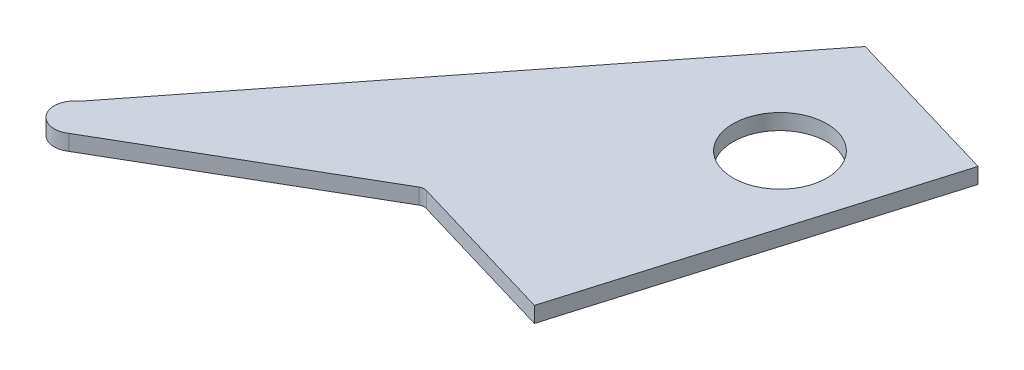
ISO-10303-21;
HEADER;
FILE_DESCRIPTION(('STEP AP214'),'2;1');
FILE_NAME('part.step','',(''),(''),'','','');
FILE_SCHEMA(('AUTOMOTIVE_DESIGN { 1 0 10303 214 1 1 1 1 }'));
ENDSEC;
DATA;
#1=APPLICATION_CONTEXT('core data for automotive mechanical design processes');
#2=APPLICATION_PROTOCOL_DEFINITION('international standard','automotive_design',2000,#1);
#3=PRODUCT_CONTEXT('',#1,'mechanical');
#4=PRODUCT('Part','Part','',(#3));
#5=PRODUCT_RELATED_PRODUCT_CATEGORY('part','',(#4));
#6=PRODUCT_DEFINITION_FORMATION('','',#4);
#7=PRODUCT_DEFINITION_CONTEXT('part definition',#1,'design');
#8=PRODUCT_DEFINITION('design','',#6,#7);
#9=PRODUCT_DEFINITION_SHAPE('','',#8);
#10=(LENGTH_UNIT() NAMED_UNIT(*) SI_UNIT(.MILLI.,.METRE.));
#11=(NAMED_UNIT(*) PLANE_ANGLE_UNIT() SI_UNIT($,.RADIAN.));
#12=(NAMED_UNIT(*) SI_UNIT($,.STERADIAN.) SOLID_ANGLE_UNIT());
#13=UNCERTAINTY_MEASURE_WITH_UNIT(LENGTH_MEASURE(1.E-05),#10,'distance_accuracy_value','');
#14=(GEOMETRIC_REPRESENTATION_CONTEXT(3) GLOBAL_UNCERTAINTY_ASSIGNED_CONTEXT((#13)) GLOBAL_UNIT_ASSIGNED_CONTEXT((#10,
#11,#12)) REPRESENTATION_CONTEXT('',''));
#15=CARTESIAN_POINT('',(0.,0.,0.));
#16=DIRECTION('',(0.,0.,1.));
#17=DIRECTION('',(1.,0.,0.));
#18=AXIS2_PLACEMENT_3D('',#15,#16,#17);
#19=CARTESIAN_POINT('',(24.2687822482393,4.7625,33.7222913548281));
#20=DIRECTION('',(0.,-1.,0.));
#21=DIRECTION('',(0.,0.,-1.));
#22=AXIS2_PLACEMENT_3D('',#19,#20,#21);
#23=CYLINDRICAL_SURFACE('',#22,2.54);
#24=CARTESIAN_POINT('',(24.2687822482393,0.,33.7222913548281));
#25=DIRECTION('',(0.,-1.,0.));
#26=DIRECTION('',(0.,0.,-1.));
#27=AXIS2_PLACEMENT_3D('',#24,#25,#26);
#28=CIRCLE('',#27,2.54);
#29=CARTESIAN_POINT('',(22.9946247329012,0.,31.5249924161065));
#30=VERTEX_POINT('',#29);
#31=CARTESIAN_POINT('',(24.9901812237873,0.,31.2868892282629));
#32=VERTEX_POINT('',#31);
#33=EDGE_CURVE('E127',#30,#32,#28,.T.);
#34=ORIENTED_EDGE('',*,*,#33,.T.);
#35=DIRECTION('',(0.,-1.,0.));
#36=VECTOR('',#35,1.);
#37=CARTESIAN_POINT('',(24.9901812237873,4.7625,31.2868892282629));
#38=LINE('',#37,#36);
#39=CARTESIAN_POINT('',(24.9901812237873,4.7625,31.2868892282629));
#40=VERTEX_POINT('',#39);
#41=EDGE_CURVE('E11',#40,#32,#38,.T.);
#42=ORIENTED_EDGE('',*,*,#41,.F.);
#43=CARTESIAN_POINT('',(24.2687822482393,4.7625,33.7222913548281));
#44=DIRECTION('',(0.,-1.,0.));
#45=DIRECTION('',(0.,0.,-1.));
#46=AXIS2_PLACEMENT_3D('',#43,#44,#45);
#47=CIRCLE('',#46,2.54);
#48=CARTESIAN_POINT('',(22.9946247329012,4.7625,31.5249924161065));
#49=VERTEX_POINT('',#48);
#50=EDGE_CURVE('E140',#49,#40,#47,.T.);
#51=ORIENTED_EDGE('',*,*,#50,.F.);
#52=DIRECTION('',(0.,-1.,0.));
#53=VECTOR('',#52,1.);
#54=CARTESIAN_POINT('',(22.9946247329012,4.7625,31.5249924161065));
#55=LINE('',#54,#53);
#56=EDGE_CURVE('E123',#49,#30,#55,.T.);
#57=ORIENTED_EDGE('',*,*,#56,.T.);
#58=EDGE_LOOP('',(#34,#42,#51,#57));
#59=FACE_BOUND('',#58,.T.);
#60=ADVANCED_FACE('F37',(#59),#23,.F.);
#61=CARTESIAN_POINT('',(71.7331323202995,4.7625,45.1327821374025));
#62=DIRECTION('',(0.284015344703924,0.,-0.958819734868193));
#63=DIRECTION('',(-0.958819734868193,0.,-0.284015344703924));
#64=AXIS2_PLACEMENT_3D('',#61,#62,#63);
#65=PLANE('',#64);
#66=DIRECTION('',(0.958819734868193,0.,0.284015344703924));
#67=VECTOR('',#66,1.);
#68=CARTESIAN_POINT('',(71.7331323202995,0.,45.1327821374025));
#69=LINE('',#68,#67);
#70=CARTESIAN_POINT('',(71.7331323202995,0.,45.1327821374025));
#71=VERTEX_POINT('',#70);
#72=EDGE_CURVE('E130',#32,#71,#69,.T.);
#73=ORIENTED_EDGE('',*,*,#72,.T.);
#74=DIRECTION('',(0.,-1.,0.));
#75=VECTOR('',#74,1.);
#76=CARTESIAN_POINT('',(71.7331323202995,4.7625,45.1327821374025));
#77=LINE('',#76,#75);
#78=CARTESIAN_POINT('',(71.7331323202995,4.7625,45.1327821374025));
#79=VERTEX_POINT('',#78);
#80=EDGE_CURVE('E45',#79,#71,#77,.T.);
#81=ORIENTED_EDGE('',*,*,#80,.F.);
#82=DIRECTION('',(0.958819734868193,0.,0.284015344703924));
#83=VECTOR('',#82,1.);
#84=CARTESIAN_POINT('',(71.7331323202995,4.7625,45.1327821374025));
#85=LINE('',#84,#83);
#86=EDGE_CURVE('E93',#40,#79,#85,.T.);
#87=ORIENTED_EDGE('',*,*,#86,.F.);
#88=ORIENTED_EDGE('',*,*,#41,.T.);
#89=EDGE_LOOP('',(#73,#81,#87,#88));
#90=FACE_BOUND('',#89,.T.);
#91=ADVANCED_FACE('F186',(#90),#65,.F.);
#92=CARTESIAN_POINT('',(102.562489384099,4.7625,-58.9453830648475));
#93=DIRECTION('',(-0.958819734868193,0.,-0.284015344703923));
#94=DIRECTION('',(-0.284015344703923,0.,0.958819734868193));
#95=AXIS2_PLACEMENT_3D('',#92,#93,#94);
#96=PLANE('',#95);
#97=DIRECTION('',(0.284015344703923,0.,-0.958819734868193));
#98=VECTOR('',#97,1.);
#99=CARTESIAN_POINT('',(102.562489384099,0.,-58.9453830648475));
#100=LINE('',#99,#98);
#101=CARTESIAN_POINT('',(102.562489384099,0.,-58.9453830648475));
#102=VERTEX_POINT('',#101);
#103=EDGE_CURVE('E133',#71,#102,#100,.T.);
#104=ORIENTED_EDGE('',*,*,#103,.T.);
#105=DIRECTION('',(0.,-1.,0.));
#106=VECTOR('',#105,1.);
#107=CARTESIAN_POINT('',(102.562489384099,4.7625,-58.9453830648475));
#108=LINE('',#107,#106);
#109=CARTESIAN_POINT('',(102.562489384099,4.7625,-58.9453830648475));
#110=VERTEX_POINT('',#109);
#111=EDGE_CURVE('E144',#110,#102,#108,.T.);
#112=ORIENTED_EDGE('',*,*,#111,.F.);
#113=DIRECTION('',(0.284015344703923,0.,-0.958819734868193));
#114=VECTOR('',#113,1.);
#115=CARTESIAN_POINT('',(102.562489384099,4.7625,-58.9453830648475));
#116=LINE('',#115,#114);
#117=EDGE_CURVE('E152',#79,#110,#116,.T.);
#118=ORIENTED_EDGE('',*,*,#117,.F.);
#119=ORIENTED_EDGE('',*,*,#80,.T.);
#120=EDGE_LOOP('',(#104,#112,#118,#119));
#121=FACE_BOUND('',#120,.T.);
#122=ADVANCED_FACE('F150',(#121),#96,.F.);
#123=CARTESIAN_POINT('',(53.8544468527947,4.7625,-73.3733625758069));
#124=DIRECTION('',(-0.284015344703923,0.,0.958819734868193));
#125=DIRECTION('',(0.958819734868193,0.,0.284015344703923));
#126=AXIS2_PLACEMENT_3D('',#123,#124,#125);
#127=PLANE('',#126);
#128=DIRECTION('',(-0.958819734868193,0.,-0.284015344703923));
#129=VECTOR('',#128,1.);
#130=CARTESIAN_POINT('',(53.8544468527947,0.,-73.3733625758069));
#131=LINE('',#130,#129);
#132=CARTESIAN_POINT('',(53.8544468527947,0.,-73.3733625758069));
#133=VERTEX_POINT('',#132);
#134=EDGE_CURVE('E135',#102,#133,#131,.T.);
#135=ORIENTED_EDGE('',*,*,#134,.T.);
#136=DIRECTION('',(0.,-1.,0.));
#137=VECTOR('',#136,1.);
#138=CARTESIAN_POINT('',(53.8544468527947,4.7625,-73.3733625758069));
#139=LINE('',#138,#137);
#140=CARTESIAN_POINT('',(53.8544468527947,4.7625,-73.3733625758069));
#141=VERTEX_POINT('',#140);
#142=EDGE_CURVE('E118',#141,#133,#139,.T.);
#143=ORIENTED_EDGE('',*,*,#142,.F.);
#144=DIRECTION('',(-0.958819734868193,0.,-0.284015344703923));
#145=VECTOR('',#144,1.);
#146=CARTESIAN_POINT('',(53.8544468527947,4.7625,-73.3733625758069));
#147=LINE('',#146,#145);
#148=EDGE_CURVE('E109',#110,#141,#147,.T.);
#149=ORIENTED_EDGE('',*,*,#148,.F.);
#150=ORIENTED_EDGE('',*,*,#111,.T.);
#151=EDGE_LOOP('',(#135,#143,#149,#150));
#152=FACE_BOUND('',#151,.T.);
#153=ADVANCED_FACE('F158',(#152),#127,.F.);
#154=CARTESIAN_POINT('',(-51.2625744636408,4.7625,60.5756932444762));
#155=DIRECTION('',(0.78668530020585,0.,0.617354224444955));
#156=DIRECTION('',(0.617354224444955,0.,-0.78668530020585));
#157=AXIS2_PLACEMENT_3D('',#154,#155,#156);
#158=PLANE('',#157);
#159=DIRECTION('',(-0.617354224444955,0.,0.78668530020585));
#160=VECTOR('',#159,1.);
#161=CARTESIAN_POINT('',(-51.2625744636408,0.,60.5756932444762));
#162=LINE('',#161,#160);
#163=CARTESIAN_POINT('',(-51.2625744636408,0.,60.5756932444762));
#164=VERTEX_POINT('',#163);
#165=EDGE_CURVE('E117',#133,#164,#162,.T.);
#166=ORIENTED_EDGE('',*,*,#165,.T.);
#167=DIRECTION('',(0.,-1.,0.));
#168=VECTOR('',#167,1.);
#169=CARTESIAN_POINT('',(-51.2625744636408,4.7625,60.5756932444762));
#170=LINE('',#169,#168);
#171=CARTESIAN_POINT('',(-51.2625744636408,4.7625,60.5756932444762));
#172=VERTEX_POINT('',#171);
#173=EDGE_CURVE('E114',#172,#164,#170,.T.);
#174=ORIENTED_EDGE('',*,*,#173,.F.);
#175=DIRECTION('',(-0.617354224444955,0.,0.78668530020585));
#176=VECTOR('',#175,1.);
#177=CARTESIAN_POINT('',(-51.2625744636408,4.7625,60.5756932444762));
#178=LINE('',#177,#176);
#179=EDGE_CURVE('E103',#141,#172,#178,.T.);
#180=ORIENTED_EDGE('',*,*,#179,.F.);
#181=ORIENTED_EDGE('',*,*,#142,.T.);
#182=EDGE_LOOP('',(#166,#174,#180,#181));
#183=FACE_BOUND('',#182,.T.);
#184=ADVANCED_FACE('F115',(#183),#158,.F.);
#185=CARTESIAN_POINT('',(-47.7943561351052,4.7625,65.5691379328517));
#186=DIRECTION('',(0.,-1.,0.));
#187=DIRECTION('',(0.,0.,-1.));
#188=AXIS2_PLACEMENT_3D('',#185,#186,#187);
#189=CYLINDRICAL_SURFACE('',#188,6.07972270998077);
#190=CARTESIAN_POINT('',(-47.7943561351052,0.,65.5691379328517));
#191=DIRECTION('',(0.,1.,0.));
#192=DIRECTION('',(0.,0.,-1.));
#193=AXIS2_PLACEMENT_3D('',#190,#191,#192);
#194=CIRCLE('',#193,6.07972270998077);
#195=CARTESIAN_POINT('',(-44.3261378065697,0.,70.5625826212273));
#196=VERTEX_POINT('',#195);
#197=EDGE_CURVE('E79',#164,#196,#194,.T.);
#198=ORIENTED_EDGE('',*,*,#197,.T.);
#199=DIRECTION('',(0.,-1.,0.));
#200=VECTOR('',#199,1.);
#201=CARTESIAN_POINT('',(-44.3261378065697,4.7625,70.5625826212273));
#202=LINE('',#201,#200);
#203=CARTESIAN_POINT('',(-44.3261378065697,4.7625,70.5625826212273));
#204=VERTEX_POINT('',#203);
#205=EDGE_CURVE('E119',#204,#196,#202,.T.);
#206=ORIENTED_EDGE('',*,*,#205,.F.);
#207=CARTESIAN_POINT('',(-47.7943561351052,4.7625,65.5691379328517));
#208=DIRECTION('',(0.,1.,0.));
#209=DIRECTION('',(0.,0.,-1.));
#210=AXIS2_PLACEMENT_3D('',#207,#208,#209);
#211=CIRCLE('',#210,6.07972270998077);
#212=EDGE_CURVE('E107',#172,#204,#211,.T.);
#213=ORIENTED_EDGE('',*,*,#212,.F.);
#214=ORIENTED_EDGE('',*,*,#173,.T.);
#215=EDGE_LOOP('',(#198,#206,#213,#214));
#216=FACE_BOUND('',#215,.T.);
#217=ADVANCED_FACE('F121',(#216),#189,.T.);
#218=CARTESIAN_POINT('',(22.9946247329012,4.7625,31.5249924161065));
#219=DIRECTION('',(-0.501636817062268,0.,-0.865078322331358));
#220=DIRECTION('',(-0.865078322331358,0.,0.501636817062268));
#221=AXIS2_PLACEMENT_3D('',#218,#219,#220);
#222=PLANE('',#221);
#223=DIRECTION('',(0.865078322331358,0.,-0.501636817062268));
#224=VECTOR('',#223,1.);
#225=CARTESIAN_POINT('',(22.9946247329012,0.,31.5249924161065));
#226=LINE('',#225,#224);
#227=EDGE_CURVE('E85',#196,#30,#226,.T.);
#228=ORIENTED_EDGE('',*,*,#227,.T.);
#229=ORIENTED_EDGE('',*,*,#56,.F.);
#230=DIRECTION('',(0.865078322331358,0.,-0.501636817062268));
#231=VECTOR('',#230,1.);
#232=CARTESIAN_POINT('',(22.9946247329012,4.7625,31.5249924161065));
#233=LINE('',#232,#231);
#234=EDGE_CURVE('E53',#204,#49,#233,.T.);
#235=ORIENTED_EDGE('',*,*,#234,.F.);
#236=ORIENTED_EDGE('',*,*,#205,.T.);
#237=EDGE_LOOP('',(#228,#229,#235,#236));
#238=FACE_BOUND('',#237,.T.);
#239=ADVANCED_FACE('F177',(#238),#222,.F.);
#240=CARTESIAN_POINT('',(24.2687822482393,4.7625,33.7222913548281));
#241=DIRECTION('',(0.,-1.,0.));
#242=DIRECTION('',(0.,0.,-1.));
#243=AXIS2_PLACEMENT_3D('',#240,#241,#242);
#244=PLANE('',#243);
#245=CARTESIAN_POINT('',(68.3613721022173,4.7625,-32.9161337927124));
#246=DIRECTION('',(0.,1.,0.));
#247=DIRECTION('',(0.,0.,1.));
#248=AXIS2_PLACEMENT_3D('',#245,#246,#247);
#249=CIRCLE('',#248,14.2874999999987);
#250=CARTESIAN_POINT('',(68.3613721022173,4.7625,-18.6286337927137));
#251=VERTEX_POINT('',#250);
#252=EDGE_CURVE('E163',#251,#251,#249,.T.);
#253=ORIENTED_EDGE('',*,*,#252,.F.);
#254=EDGE_LOOP('',(#253));
#255=FACE_BOUND('',#254,.T.);
#256=ORIENTED_EDGE('',*,*,#50,.T.);
#257=ORIENTED_EDGE('',*,*,#86,.T.);
#258=ORIENTED_EDGE('',*,*,#117,.T.);
#259=ORIENTED_EDGE('',*,*,#148,.T.);
#260=ORIENTED_EDGE('',*,*,#179,.T.);
#261=ORIENTED_EDGE('',*,*,#212,.T.);
#262=ORIENTED_EDGE('',*,*,#234,.T.);
#263=EDGE_LOOP('',(#256,#257,#258,#259,#260,#261,#262));
#264=FACE_BOUND('',#263,.T.);
#265=ADVANCED_FACE('F105',(#255,#264),#244,.F.);
#266=CARTESIAN_POINT('',(24.2687822482393,0.,33.7222913548281));
#267=DIRECTION('',(0.,-1.,0.));
#268=DIRECTION('',(0.,0.,-1.));
#269=AXIS2_PLACEMENT_3D('',#266,#267,#268);
#270=PLANE('',#269);
#271=CARTESIAN_POINT('',(68.3613721022173,0.,-32.9161337927124));
#272=DIRECTION('',(0.,1.,0.));
#273=DIRECTION('',(0.,0.,1.));
#274=AXIS2_PLACEMENT_3D('',#271,#272,#273);
#275=CIRCLE('',#274,14.2874999999987);
#276=CARTESIAN_POINT('',(68.3613721022173,0.,-18.6286337927137));
#277=VERTEX_POINT('',#276);
#278=EDGE_CURVE('E131',#277,#277,#275,.T.);
#279=ORIENTED_EDGE('',*,*,#278,.T.);
#280=EDGE_LOOP('',(#279));
#281=FACE_BOUND('',#280,.T.);
#282=ORIENTED_EDGE('',*,*,#33,.F.);
#283=ORIENTED_EDGE('',*,*,#227,.F.);
#284=ORIENTED_EDGE('',*,*,#197,.F.);
#285=ORIENTED_EDGE('',*,*,#165,.F.);
#286=ORIENTED_EDGE('',*,*,#134,.F.);
#287=ORIENTED_EDGE('',*,*,#103,.F.);
#288=ORIENTED_EDGE('',*,*,#72,.F.);
#289=EDGE_LOOP('',(#282,#283,#284,#285,#286,#287,#288));
#290=FACE_BOUND('',#289,.T.);
#291=ADVANCED_FACE('F156',(#281,#290),#270,.T.);
#292=CARTESIAN_POINT('',(68.3613721022173,0.,-32.9161337927124));
#293=DIRECTION('',(0.,1.,0.));
#294=DIRECTION('',(0.,0.,1.));
#295=AXIS2_PLACEMENT_3D('',#292,#293,#294);
#296=CYLINDRICAL_SURFACE('',#295,14.2874999999987);
#297=CARTESIAN_POINT('',(68.3613721022173,0.,-18.6286337927137));
#298=CARTESIAN_POINT('',(68.3613721022173,0.049609375,-18.6286337927137));
#299=CARTESIAN_POINT('',(68.3613721022173,0.09921875,-18.6286337927137));
#300=CARTESIAN_POINT('',(68.3613721022173,0.1984375,-18.6286337927137));
#301=CARTESIAN_POINT('',(68.3613721022173,0.248046875,-18.6286337927137));
#302=CARTESIAN_POINT('',(68.3613721022173,0.347265625,-18.6286337927137));
#303=CARTESIAN_POINT('',(68.3613721022173,0.396875,-18.6286337927137));
#304=CARTESIAN_POINT('',(68.3613721022173,0.49609375,-18.6286337927137));
#305=CARTESIAN_POINT('',(68.3613721022173,0.545703125,-18.6286337927137));
#306=CARTESIAN_POINT('',(68.3613721022173,0.644921875,-18.6286337927137));
#307=CARTESIAN_POINT('',(68.3613721022173,0.69453125,-18.6286337927137));
#308=CARTESIAN_POINT('',(68.3613721022173,0.79375,-18.6286337927137));
#309=CARTESIAN_POINT('',(68.3613721022173,0.843359375,-18.6286337927137));
#310=CARTESIAN_POINT('',(68.3613721022173,0.942578125,-18.6286337927137));
#311=CARTESIAN_POINT('',(68.3613721022173,0.9921875,-18.6286337927137));
#312=CARTESIAN_POINT('',(68.3613721022173,1.09140625,-18.6286337927137));
#313=CARTESIAN_POINT('',(68.3613721022173,1.141015625,-18.6286337927137));
#314=CARTESIAN_POINT('',(68.3613721022173,1.240234375,-18.6286337927137));
#315=CARTESIAN_POINT('',(68.3613721022173,1.28984375,-18.6286337927137));
#316=CARTESIAN_POINT('',(68.3613721022173,1.3890625,-18.6286337927137));
#317=CARTESIAN_POINT('',(68.3613721022173,1.438671875,-18.6286337927137));
#318=CARTESIAN_POINT('',(68.3613721022173,1.537890625,-18.6286337927137));
#319=CARTESIAN_POINT('',(68.3613721022173,1.5875,-18.6286337927137));
#320=CARTESIAN_POINT('',(68.3613721022173,1.68671875,-18.6286337927137));
#321=CARTESIAN_POINT('',(68.3613721022173,1.736328125,-18.6286337927137));
#322=CARTESIAN_POINT('',(68.3613721022173,1.835546875,-18.6286337927137));
#323=CARTESIAN_POINT('',(68.3613721022173,1.88515625,-18.6286337927137));
#324=CARTESIAN_POINT('',(68.3613721022173,1.984375,-18.6286337927137));
#325=CARTESIAN_POINT('',(68.3613721022173,2.033984375,-18.6286337927137));
#326=CARTESIAN_POINT('',(68.3613721022173,2.133203125,-18.6286337927137));
#327=CARTESIAN_POINT('',(68.3613721022173,2.1828125,-18.6286337927137));
#328=CARTESIAN_POINT('',(68.3613721022173,2.28203125,-18.6286337927137));
#329=CARTESIAN_POINT('',(68.3613721022173,2.331640625,-18.6286337927137));
#330=CARTESIAN_POINT('',(68.3613721022173,2.430859375,-18.6286337927137));
#331=CARTESIAN_POINT('',(68.3613721022173,2.48046875,-18.6286337927137));
#332=CARTESIAN_POINT('',(68.3613721022173,2.5796875,-18.6286337927137));
#333=CARTESIAN_POINT('',(68.3613721022173,2.629296875,-18.6286337927137));
#334=CARTESIAN_POINT('',(68.3613721022173,2.728515625,-18.6286337927137));
#335=CARTESIAN_POINT('',(68.3613721022173,2.778125,-18.6286337927137));
#336=CARTESIAN_POINT('',(68.3613721022173,2.87734375,-18.6286337927137));
#337=CARTESIAN_POINT('',(68.3613721022173,2.926953125,-18.6286337927137));
#338=CARTESIAN_POINT('',(68.3613721022173,3.026171875,-18.6286337927137));
#339=CARTESIAN_POINT('',(68.3613721022173,3.07578125,-18.6286337927137));
#340=CARTESIAN_POINT('',(68.3613721022173,3.175,-18.6286337927137));
#341=CARTESIAN_POINT('',(68.3613721022173,3.224609375,-18.6286337927137));
#342=CARTESIAN_POINT('',(68.3613721022173,3.323828125,-18.6286337927137));
#343=CARTESIAN_POINT('',(68.3613721022173,3.3734375,-18.6286337927137));
#344=CARTESIAN_POINT('',(68.3613721022173,3.47265625,-18.6286337927137));
#345=CARTESIAN_POINT('',(68.3613721022173,3.522265625,-18.6286337927137));
#346=CARTESIAN_POINT('',(68.3613721022173,3.621484375,-18.6286337927137));
#347=CARTESIAN_POINT('',(68.3613721022173,3.67109375,-18.6286337927137));
#348=CARTESIAN_POINT('',(68.3613721022173,3.7703125,-18.6286337927137));
#349=CARTESIAN_POINT('',(68.3613721022173,3.819921875,-18.6286337927137));
#350=CARTESIAN_POINT('',(68.3613721022173,3.919140625,-18.6286337927137));
#351=CARTESIAN_POINT('',(68.3613721022173,3.96875,-18.6286337927137));
#352=CARTESIAN_POINT('',(68.3613721022173,4.06796875,-18.6286337927137));
#353=CARTESIAN_POINT('',(68.3613721022173,4.117578125,-18.6286337927137));
#354=CARTESIAN_POINT('',(68.3613721022173,4.216796875,-18.6286337927137));
#355=CARTESIAN_POINT('',(68.3613721022173,4.26640625,-18.6286337927137));
#356=CARTESIAN_POINT('',(68.3613721022173,4.365625,-18.6286337927137));
#357=CARTESIAN_POINT('',(68.3613721022173,4.415234375,-18.6286337927137));
#358=CARTESIAN_POINT('',(68.3613721022173,4.514453125,-18.6286337927137));
#359=CARTESIAN_POINT('',(68.3613721022173,4.5640625,-18.6286337927137));
#360=CARTESIAN_POINT('',(68.3613721022173,4.66328125,-18.6286337927137));
#361=CARTESIAN_POINT('',(68.3613721022173,4.712890625,-18.6286337927137));
#362=CARTESIAN_POINT('',(68.3613721022173,4.7625,-18.6286337927137));
#363=B_SPLINE_CURVE_WITH_KNOTS('',3,(#297,#298,#299,#300,#301,#302,#303,#304,#305,#306,#307,
#308,#309,#310,#311,#312,#313,#314,#315,#316,#317,#318,#319,#320,#321,#322,#323,#324,#325,#326,
#327,#328,#329,#330,#331,#332,#333,#334,#335,#336,#337,#338,#339,#340,#341,#342,#343,#344,#345,
#346,#347,#348,#349,#350,#351,#352,#353,#354,#355,#356,#357,#358,#359,#360,#361,#362),
.UNSPECIFIED.,.F.,.F.,(4,2,2,2,2,2,2,2,2,2,2,2,2,2,2,2,2,2,2,2,2,2,2,2,2,2,2,2,2,2,2,2,4),(0.,
0.148828125,0.29765625,0.446484375,0.5953125,0.744140625,0.89296875,1.041796875,1.190625,
1.339453125,1.48828125,1.637109375,1.7859375,1.934765625,2.08359375,2.232421875,2.38125,
2.530078125,2.67890625,2.827734375,2.9765625,3.125390625,3.27421875,3.423046875,3.571875,
3.720703125,3.86953125,4.018359375,4.1671875,4.316015625,4.46484375,4.613671875,4.7625),.UNSPECIFIED.);
#364=EDGE_CURVE('BSEAM170',#277,#251,#363,.T.);
#365=ORIENTED_EDGE('',*,*,#278,.F.);
#366=ORIENTED_EDGE('',*,*,#252,.T.);
#367=ORIENTED_EDGE('',*,*,#364,.T.);
#368=ORIENTED_EDGE('',*,*,#364,.F.);
#369=EDGE_LOOP('',(#365,#367,#366,#368));
#370=FACE_BOUND('',#369,.T.);
#371=ADVANCED_FACE('F170',(#370),#296,.F.);
#372=CLOSED_SHELL('',(#60,#91,#122,#153,#184,#217,#239,#265,#291,#371));
#373=MANIFOLD_SOLID_BREP('B2',#372);
#374=ADVANCED_BREP_SHAPE_REPRESENTATION('',(#18,#373),#14);
#375=SHAPE_DEFINITION_REPRESENTATION(#9,#374);
ENDSEC;
END-ISO-10303-21;
